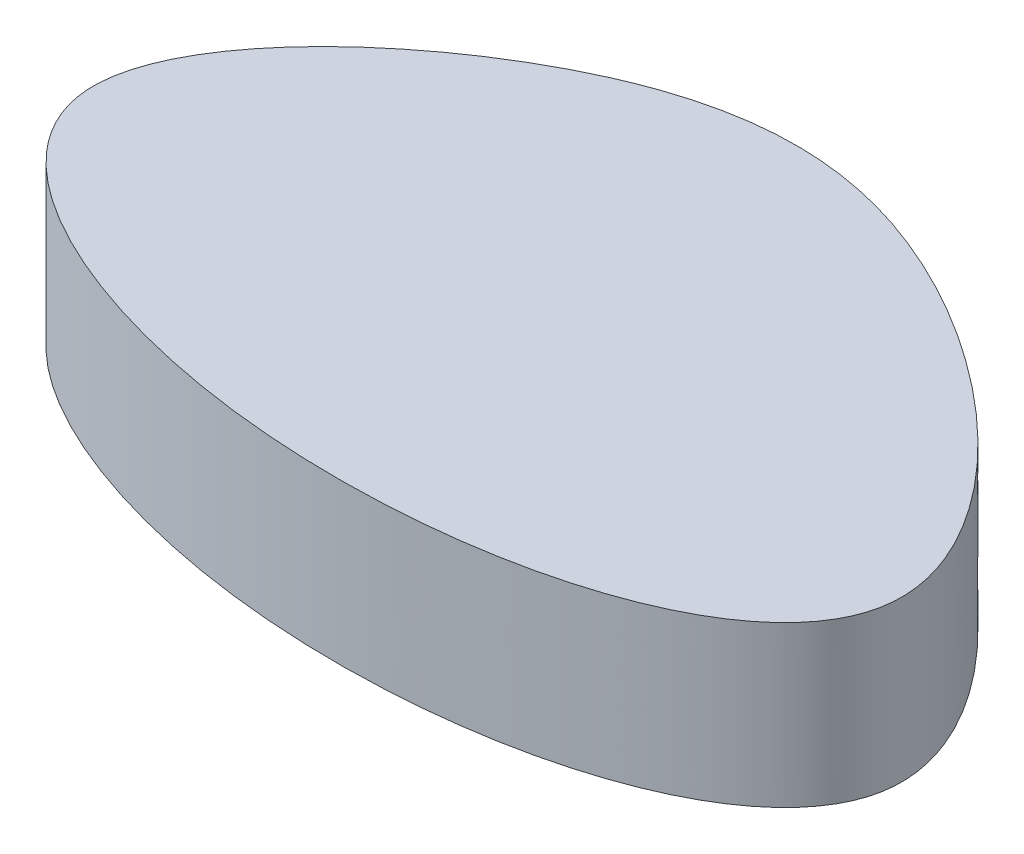
ISO-10303-21;
HEADER;
FILE_DESCRIPTION(('STEP AP214'),'2;1');
FILE_NAME('part.step','',(''),(''),'','','');
FILE_SCHEMA(('AUTOMOTIVE_DESIGN { 1 0 10303 214 1 1 1 1 }'));
ENDSEC;
DATA;
#1=APPLICATION_CONTEXT('core data for automotive mechanical design processes');
#2=APPLICATION_PROTOCOL_DEFINITION('international standard','automotive_design',2000,#1);
#3=PRODUCT_CONTEXT('',#1,'mechanical');
#4=PRODUCT('Part','Part','',(#3));
#5=PRODUCT_RELATED_PRODUCT_CATEGORY('part','',(#4));
#6=PRODUCT_DEFINITION_FORMATION('','',#4);
#7=PRODUCT_DEFINITION_CONTEXT('part definition',#1,'design');
#8=PRODUCT_DEFINITION('design','',#6,#7);
#9=PRODUCT_DEFINITION_SHAPE('','',#8);
#10=(LENGTH_UNIT() NAMED_UNIT(*) SI_UNIT(.MILLI.,.METRE.));
#11=(NAMED_UNIT(*) PLANE_ANGLE_UNIT() SI_UNIT($,.RADIAN.));
#12=(NAMED_UNIT(*) SI_UNIT($,.STERADIAN.) SOLID_ANGLE_UNIT());
#13=UNCERTAINTY_MEASURE_WITH_UNIT(LENGTH_MEASURE(1.E-05),#10,'distance_accuracy_value','');
#14=(GEOMETRIC_REPRESENTATION_CONTEXT(3) GLOBAL_UNCERTAINTY_ASSIGNED_CONTEXT((#13)) GLOBAL_UNIT_ASSIGNED_CONTEXT((#10,
#11,#12)) REPRESENTATION_CONTEXT('',''));
#15=CARTESIAN_POINT('',(0.,0.,0.));
#16=DIRECTION('',(0.,0.,1.));
#17=DIRECTION('',(1.,0.,0.));
#18=AXIS2_PLACEMENT_3D('',#15,#16,#17);
#19=CARTESIAN_POINT('',(-54.3402157384064,46.736,-54.0790900585813));
#20=CARTESIAN_POINT('',(-90.5466977601749,46.736,-37.9717723865272));
#21=CARTESIAN_POINT('',(-167.752840572188,46.736,31.6836895458365));
#22=CARTESIAN_POINT('',(-20.3818038497874,46.736,107.945223121837));
#23=CARTESIAN_POINT('',(186.192424521261,46.736,60.8589683322148));
#24=CARTESIAN_POINT('',(38.6571216538612,46.736,-71.144295095719));
#25=CARTESIAN_POINT('',(-29.2243449675775,46.736,-65.2524846146382));
#26=CARTESIAN_POINT('',(-54.3402157384064,46.736,-54.0790900585813));
#27=B_SPLINE_CURVE_WITH_KNOTS('',3,(#19,#20,#21,#22,#23,#24,#25,#26),.UNSPECIFIED.,.T.,.F.,(4,1,
1,1,1,4),(0.,0.182563018676383,0.363080882724563,0.639677126014647,0.873358886901752,1.),.UNSPECIFIED.);
#28=DIRECTION('',(0.,-1.,0.));
#29=VECTOR('',#28,1.);
#30=SURFACE_OF_LINEAR_EXTRUSION('',#27,#29);
#31=CARTESIAN_POINT('',(-54.3402157384064,46.736,-54.0790900585813));
#32=VERTEX_POINT('',#31);
#33=EDGE_CURVE('E10',#32,#32,#27,.T.);
#34=ORIENTED_EDGE('',*,*,#33,.F.);
#35=EDGE_LOOP('',(#34));
#36=FACE_BOUND('',#35,.T.);
#37=CARTESIAN_POINT('',(-54.3402157384064,0.,-54.0790900585813));
#38=CARTESIAN_POINT('',(-90.5466977601749,0.,-37.9717723865272));
#39=CARTESIAN_POINT('',(-167.752840572188,0.,31.6836895458365));
#40=CARTESIAN_POINT('',(-20.3818038497874,0.,107.945223121837));
#41=CARTESIAN_POINT('',(186.192424521261,0.,60.8589683322148));
#42=CARTESIAN_POINT('',(38.6571216538612,0.,-71.144295095719));
#43=CARTESIAN_POINT('',(-29.2243449675775,0.,-65.2524846146382));
#44=CARTESIAN_POINT('',(-54.3402157384064,0.,-54.0790900585813));
#45=B_SPLINE_CURVE_WITH_KNOTS('',3,(#37,#38,#39,#40,#41,#42,#43,#44),.UNSPECIFIED.,.T.,.F.,(4,1,
1,1,1,4),(0.,0.182563018676383,0.363080882724563,0.639677126014647,0.873358886901752,1.),.UNSPECIFIED.);
#46=CARTESIAN_POINT('',(-54.3402157384064,0.,-54.0790900585813));
#47=VERTEX_POINT('',#46);
#48=EDGE_CURVE('E36',#47,#47,#45,.T.);
#49=ORIENTED_EDGE('',*,*,#48,.T.);
#50=EDGE_LOOP('',(#49));
#51=FACE_BOUND('',#50,.T.);
#52=ADVANCED_FACE('F32',(#36,#51),#30,.F.);
#53=CARTESIAN_POINT('',(65.5479393055537,46.736,79.9278615348992));
#54=DIRECTION('',(0.,1.,0.));
#55=DIRECTION('',(0.,0.,1.));
#56=AXIS2_PLACEMENT_3D('',#53,#54,#55);
#57=PLANE('',#56);
#58=ORIENTED_EDGE('',*,*,#33,.T.);
#59=EDGE_LOOP('',(#58));
#60=FACE_BOUND('',#59,.T.);
#61=ADVANCED_FACE('F55',(#60),#57,.T.);
#62=CARTESIAN_POINT('',(65.5479393055537,0.,79.9278615348992));
#63=DIRECTION('',(0.,1.,0.));
#64=DIRECTION('',(0.,0.,1.));
#65=AXIS2_PLACEMENT_3D('',#62,#63,#64);
#66=PLANE('',#65);
#67=ORIENTED_EDGE('',*,*,#48,.F.);
#68=EDGE_LOOP('',(#67));
#69=FACE_BOUND('',#68,.T.);
#70=ADVANCED_FACE('F53',(#69),#66,.F.);
#71=CLOSED_SHELL('',(#52,#61,#70));
#72=MANIFOLD_SOLID_BREP('B2',#71);
#73=ADVANCED_BREP_SHAPE_REPRESENTATION('',(#18,#72),#14);
#74=SHAPE_DEFINITION_REPRESENTATION(#9,#73);
ENDSEC;
END-ISO-10303-21;
